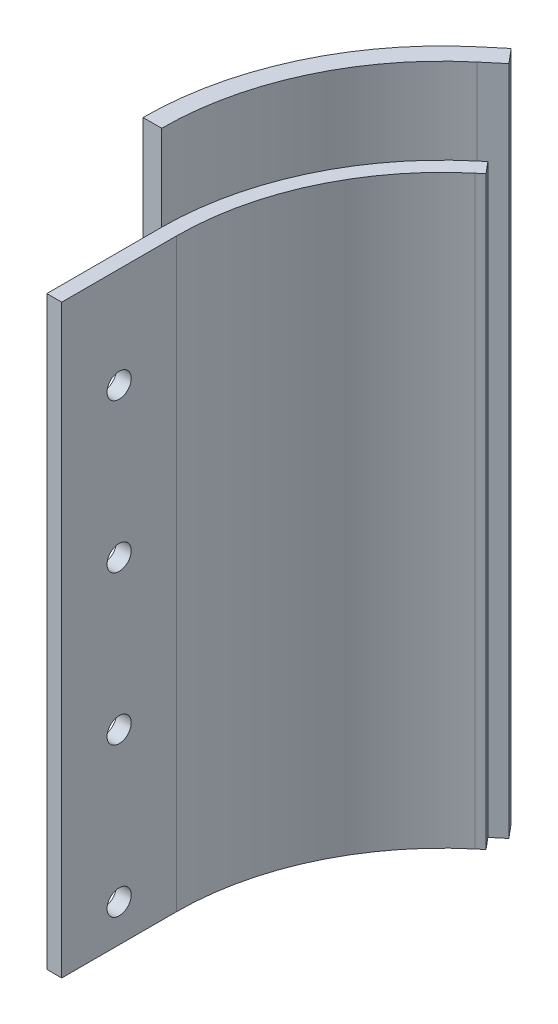
ISO-10303-21;
HEADER;
FILE_DESCRIPTION(('STEP AP214'),'2;1');
FILE_NAME('part.step','',(''),(''),'','','');
FILE_SCHEMA(('AUTOMOTIVE_DESIGN { 1 0 10303 214 1 1 1 1 }'));
ENDSEC;
DATA;
#1=APPLICATION_CONTEXT('core data for automotive mechanical design processes');
#2=APPLICATION_PROTOCOL_DEFINITION('international standard','automotive_design',2000,#1);
#3=PRODUCT_CONTEXT('',#1,'mechanical');
#4=PRODUCT('Part','Part','',(#3));
#5=PRODUCT_RELATED_PRODUCT_CATEGORY('part','',(#4));
#6=PRODUCT_DEFINITION_FORMATION('','',#4);
#7=PRODUCT_DEFINITION_CONTEXT('part definition',#1,'design');
#8=PRODUCT_DEFINITION('design','',#6,#7);
#9=PRODUCT_DEFINITION_SHAPE('','',#8);
#10=(LENGTH_UNIT() NAMED_UNIT(*) SI_UNIT(.MILLI.,.METRE.));
#11=(NAMED_UNIT(*) PLANE_ANGLE_UNIT() SI_UNIT($,.RADIAN.));
#12=(NAMED_UNIT(*) SI_UNIT($,.STERADIAN.) SOLID_ANGLE_UNIT());
#13=UNCERTAINTY_MEASURE_WITH_UNIT(LENGTH_MEASURE(1.E-05),#10,'distance_accuracy_value','');
#14=(GEOMETRIC_REPRESENTATION_CONTEXT(3) GLOBAL_UNCERTAINTY_ASSIGNED_CONTEXT((#13)) GLOBAL_UNIT_ASSIGNED_CONTEXT((#10,
#11,#12)) REPRESENTATION_CONTEXT('',''));
#15=CARTESIAN_POINT('',(0.,0.,0.));
#16=DIRECTION('',(0.,0.,1.));
#17=DIRECTION('',(1.,0.,0.));
#18=AXIS2_PLACEMENT_3D('',#15,#16,#17);
#19=CARTESIAN_POINT('',(18.3464398654779,200.,-65.4116710658726));
#20=DIRECTION('',(-0.766044443118983,0.,0.642787609686533));
#21=DIRECTION('',(0.642787609686533,0.,0.766044443118983));
#22=AXIS2_PLACEMENT_3D('',#19,#20,#21);
#23=PLANE('',#22);
#24=DIRECTION('',(0.,-1.,0.));
#25=VECTOR('',#24,1.);
#26=CARTESIAN_POINT('',(21.5603779139106,200.,-61.5814488502777));
#27=LINE('',#26,#25);
#28=CARTESIAN_POINT('',(21.5603779139106,200.,-61.5814488502777));
#29=VERTEX_POINT('',#28);
#30=CARTESIAN_POINT('',(21.5603779139106,20.,-61.5814488502777));
#31=VERTEX_POINT('',#30);
#32=EDGE_CURVE('E223',#29,#31,#27,.T.);
#33=ORIENTED_EDGE('',*,*,#32,.T.);
#34=DIRECTION('',(-0.642787609686533,0.,-0.766044443118983));
#35=VECTOR('',#34,1.);
#36=CARTESIAN_POINT('',(18.3464398654779,20.,-65.4116710658726));
#37=LINE('',#36,#35);
#38=CARTESIAN_POINT('',(18.3464398654779,20.,-65.4116710658726));
#39=VERTEX_POINT('',#38);
#40=EDGE_CURVE('E142',#31,#39,#37,.T.);
#41=ORIENTED_EDGE('',*,*,#40,.T.);
#42=DIRECTION('',(0.,-1.,0.));
#43=VECTOR('',#42,1.);
#44=CARTESIAN_POINT('',(18.3464398654779,200.,-65.4116710658726));
#45=LINE('',#44,#43);
#46=CARTESIAN_POINT('',(18.3464398654779,200.,-65.4116710658726));
#47=VERTEX_POINT('',#46);
#48=EDGE_CURVE('E40',#47,#39,#45,.T.);
#49=ORIENTED_EDGE('',*,*,#48,.F.);
#50=DIRECTION('',(-0.642787609686533,0.,-0.766044443118983));
#51=VECTOR('',#50,1.);
#52=CARTESIAN_POINT('',(18.3464398654779,200.,-65.4116710658726));
#53=LINE('',#52,#51);
#54=EDGE_CURVE('E209',#29,#47,#53,.T.);
#55=ORIENTED_EDGE('',*,*,#54,.F.);
#56=EDGE_LOOP('',(#33,#41,#49,#55));
#57=FACE_BOUND('',#56,.T.);
#58=ADVANCED_FACE('F33',(#57),#23,.F.);
#59=CARTESIAN_POINT('',(18.3464398654779,200.,-65.4116710658726));
#60=DIRECTION('',(0.642787609686534,0.,0.766044443118983));
#61=DIRECTION('',(0.766044443118983,0.,-0.642787609686534));
#62=AXIS2_PLACEMENT_3D('',#59,#60,#61);
#63=PLANE('',#62);
#64=DIRECTION('',(-0.766044443118983,0.,0.642787609686534));
#65=VECTOR('',#64,1.);
#66=CARTESIAN_POINT('',(18.3464398654779,20.,-65.4116710658726));
#67=LINE('',#66,#65);
#68=CARTESIAN_POINT('',(13.6735687624521,20.,-61.4906666467847));
#69=VERTEX_POINT('',#68);
#70=EDGE_CURVE('E225',#39,#69,#67,.T.);
#71=ORIENTED_EDGE('',*,*,#70,.T.);
#72=DIRECTION('',(0.,-1.,0.));
#73=VECTOR('',#72,1.);
#74=CARTESIAN_POINT('',(13.6735687624521,200.,-61.4906666467847));
#75=LINE('',#74,#73);
#76=CARTESIAN_POINT('',(13.6735687624521,200.,-61.4906666467847));
#77=VERTEX_POINT('',#76);
#78=EDGE_CURVE('E238',#77,#69,#75,.T.);
#79=ORIENTED_EDGE('',*,*,#78,.F.);
#80=DIRECTION('',(-0.766044443118983,0.,0.642787609686534));
#81=VECTOR('',#80,1.);
#82=CARTESIAN_POINT('',(18.3464398654779,200.,-65.4116710658726));
#83=LINE('',#82,#81);
#84=EDGE_CURVE('E212',#47,#77,#83,.T.);
#85=ORIENTED_EDGE('',*,*,#84,.F.);
#86=ORIENTED_EDGE('',*,*,#48,.T.);
#87=EDGE_LOOP('',(#71,#79,#85,#86));
#88=FACE_BOUND('',#87,.T.);
#89=ADVANCED_FACE('F243',(#88),#63,.F.);
#90=CARTESIAN_POINT('',(65.2703644666136,200.,0.));
#91=DIRECTION('',(0.,-1.,0.));
#92=DIRECTION('',(0.,0.,-1.));
#93=AXIS2_PLACEMENT_3D('',#90,#91,#92);
#94=CYLINDRICAL_SURFACE('',#93,80.2703644666136);
#95=CARTESIAN_POINT('',(65.2703644666136,20.,0.));
#96=DIRECTION('',(0.,1.,0.));
#97=DIRECTION('',(0.,0.,1.));
#98=AXIS2_PLACEMENT_3D('',#95,#96,#97);
#99=CIRCLE('',#98,80.2703644666136);
#100=CARTESIAN_POINT('',(-15.,20.,0.));
#101=VERTEX_POINT('',#100);
#102=EDGE_CURVE('E227',#69,#101,#99,.T.);
#103=ORIENTED_EDGE('',*,*,#102,.T.);
#104=DIRECTION('',(0.,-1.,0.));
#105=VECTOR('',#104,1.);
#106=CARTESIAN_POINT('',(-15.,200.,0.));
#107=LINE('',#106,#105);
#108=CARTESIAN_POINT('',(-15.,200.,0.));
#109=VERTEX_POINT('',#108);
#110=EDGE_CURVE('E235',#109,#101,#107,.T.);
#111=ORIENTED_EDGE('',*,*,#110,.F.);
#112=CARTESIAN_POINT('',(65.2703644666136,200.,0.));
#113=DIRECTION('',(0.,1.,0.));
#114=DIRECTION('',(0.,0.,1.));
#115=AXIS2_PLACEMENT_3D('',#112,#113,#114);
#116=CIRCLE('',#115,80.2703644666136);
#117=EDGE_CURVE('E215',#77,#109,#116,.T.);
#118=ORIENTED_EDGE('',*,*,#117,.F.);
#119=ORIENTED_EDGE('',*,*,#78,.T.);
#120=EDGE_LOOP('',(#103,#111,#118,#119));
#121=FACE_BOUND('',#120,.T.);
#122=ADVANCED_FACE('F251',(#121),#94,.T.);
#123=CARTESIAN_POINT('',(-15.,200.,0.));
#124=DIRECTION('',(0.,0.,-1.));
#125=DIRECTION('',(-1.,0.,0.));
#126=AXIS2_PLACEMENT_3D('',#123,#124,#125);
#127=PLANE('',#126);
#128=DIRECTION('',(1.,0.,0.));
#129=VECTOR('',#128,1.);
#130=CARTESIAN_POINT('',(-15.,20.,0.));
#131=LINE('',#130,#129);
#132=CARTESIAN_POINT('',(-9.99999999999999,20.,0.));
#133=VERTEX_POINT('',#132);
#134=EDGE_CURVE('E213',#101,#133,#131,.T.);
#135=ORIENTED_EDGE('',*,*,#134,.T.);
#136=DIRECTION('',(0.,1.,0.));
#137=VECTOR('',#136,1.);
#138=CARTESIAN_POINT('',(-9.99999999999999,-78.4842230054058,0.));
#139=LINE('',#138,#137);
#140=CARTESIAN_POINT('',(-9.99999999999999,177.,0.));
#141=VERTEX_POINT('',#140);
#142=EDGE_CURVE('E54',#133,#141,#139,.T.);
#143=ORIENTED_EDGE('',*,*,#142,.T.);
#144=DIRECTION('',(0.,-1.,0.));
#145=VECTOR('',#144,1.);
#146=CARTESIAN_POINT('',(-9.99999999999999,200.,0.));
#147=LINE('',#146,#145);
#148=CARTESIAN_POINT('',(-9.99999999999999,200.,0.));
#149=VERTEX_POINT('',#148);
#150=EDGE_CURVE('E233',#149,#141,#147,.T.);
#151=ORIENTED_EDGE('',*,*,#150,.F.);
#152=DIRECTION('',(1.,0.,0.));
#153=VECTOR('',#152,1.);
#154=CARTESIAN_POINT('',(-15.,200.,0.));
#155=LINE('',#154,#153);
#156=EDGE_CURVE('E217',#109,#149,#155,.T.);
#157=ORIENTED_EDGE('',*,*,#156,.F.);
#158=ORIENTED_EDGE('',*,*,#110,.T.);
#159=EDGE_LOOP('',(#135,#143,#151,#157,#158));
#160=FACE_BOUND('',#159,.T.);
#161=ADVANCED_FACE('F254',(#160),#127,.F.);
#162=CARTESIAN_POINT('',(65.2703644666136,200.,0.));
#163=DIRECTION('',(0.,-1.,0.));
#164=DIRECTION('',(0.,0.,-1.));
#165=AXIS2_PLACEMENT_3D('',#162,#163,#164);
#166=CYLINDRICAL_SURFACE('',#165,75.2703644666136);
#167=ORIENTED_EDGE('',*,*,#150,.T.);
#168=CARTESIAN_POINT('',(65.2703644666136,177.,0.));
#169=DIRECTION('',(0.,1.,0.));
#170=DIRECTION('',(0.,0.,1.));
#171=AXIS2_PLACEMENT_3D('',#168,#169,#170);
#172=CIRCLE('',#171,75.2703644666136);
#173=CARTESIAN_POINT('',(16.8875068108848,177.,-57.6604444311898));
#174=VERTEX_POINT('',#173);
#175=EDGE_CURVE('E170',#174,#141,#172,.T.);
#176=ORIENTED_EDGE('',*,*,#175,.F.);
#177=DIRECTION('',(0.,-1.,0.));
#178=VECTOR('',#177,1.);
#179=CARTESIAN_POINT('',(16.8875068108848,200.,-57.6604444311898));
#180=LINE('',#179,#178);
#181=CARTESIAN_POINT('',(16.8875068108848,200.,-57.6604444311898));
#182=VERTEX_POINT('',#181);
#183=EDGE_CURVE('E231',#182,#174,#180,.T.);
#184=ORIENTED_EDGE('',*,*,#183,.F.);
#185=CARTESIAN_POINT('',(65.2703644666136,200.,0.));
#186=DIRECTION('',(0.,-1.,0.));
#187=DIRECTION('',(0.,0.,1.));
#188=AXIS2_PLACEMENT_3D('',#185,#186,#187);
#189=CIRCLE('',#188,75.2703644666136);
#190=EDGE_CURVE('E219',#149,#182,#189,.T.);
#191=ORIENTED_EDGE('',*,*,#190,.F.);
#192=EDGE_LOOP('',(#167,#176,#184,#191));
#193=FACE_BOUND('',#192,.T.);
#194=ADVANCED_FACE('F262',(#193),#166,.F.);
#195=CARTESIAN_POINT('',(21.5603779139106,200.,-61.5814488502777));
#196=DIRECTION('',(-0.642787609686533,0.,-0.766044443118983));
#197=DIRECTION('',(-0.766044443118983,0.,0.642787609686533));
#198=AXIS2_PLACEMENT_3D('',#195,#196,#197);
#199=PLANE('',#198);
#200=DIRECTION('',(-0.766044443118983,0.,0.642787609686533));
#201=VECTOR('',#200,1.);
#202=CARTESIAN_POINT('',(16.8875068108848,177.,-57.6604444311898));
#203=LINE('',#202,#201);
#204=CARTESIAN_POINT('',(18.4962001414346,177.,-59.0102984115315));
#205=VERTEX_POINT('',#204);
#206=EDGE_CURVE('E130',#205,#174,#203,.T.);
#207=ORIENTED_EDGE('',*,*,#206,.F.);
#208=DIRECTION('',(0.,1.,0.));
#209=VECTOR('',#208,1.);
#210=CARTESIAN_POINT('',(18.4962001414346,20.,-59.0102984115315));
#211=LINE('',#210,#209);
#212=CARTESIAN_POINT('',(18.4962001414346,20.,-59.0102984115315));
#213=VERTEX_POINT('',#212);
#214=EDGE_CURVE('E46',#213,#205,#211,.T.);
#215=ORIENTED_EDGE('',*,*,#214,.F.);
#216=DIRECTION('',(-0.766044443118982,0.,0.642787609686534));
#217=VECTOR('',#216,1.);
#218=CARTESIAN_POINT('',(21.5603779139106,20.,-61.5814488502777));
#219=LINE('',#218,#217);
#220=EDGE_CURVE('E127',#31,#213,#219,.T.);
#221=ORIENTED_EDGE('',*,*,#220,.F.);
#222=ORIENTED_EDGE('',*,*,#32,.F.);
#223=DIRECTION('',(0.766044443118983,0.,-0.642787609686533));
#224=VECTOR('',#223,1.);
#225=CARTESIAN_POINT('',(21.5603779139106,200.,-61.5814488502777));
#226=LINE('',#225,#224);
#227=EDGE_CURVE('E221',#182,#29,#226,.T.);
#228=ORIENTED_EDGE('',*,*,#227,.F.);
#229=ORIENTED_EDGE('',*,*,#183,.T.);
#230=EDGE_LOOP('',(#207,#215,#221,#222,#228,#229));
#231=FACE_BOUND('',#230,.T.);
#232=ADVANCED_FACE('F124',(#231),#199,.F.);
#233=CARTESIAN_POINT('',(65.2703644666136,200.,0.));
#234=DIRECTION('',(0.,1.,0.));
#235=DIRECTION('',(0.,0.,1.));
#236=AXIS2_PLACEMENT_3D('',#233,#234,#235);
#237=PLANE('',#236);
#238=ORIENTED_EDGE('',*,*,#54,.T.);
#239=ORIENTED_EDGE('',*,*,#84,.T.);
#240=ORIENTED_EDGE('',*,*,#117,.T.);
#241=ORIENTED_EDGE('',*,*,#156,.T.);
#242=ORIENTED_EDGE('',*,*,#190,.T.);
#243=ORIENTED_EDGE('',*,*,#227,.T.);
#244=EDGE_LOOP('',(#238,#239,#240,#241,#242,#243));
#245=FACE_BOUND('',#244,.T.);
#246=ADVANCED_FACE('F257',(#245),#237,.T.);
#247=CARTESIAN_POINT('',(65.2703644666136,20.,0.));
#248=DIRECTION('',(0.,1.,0.));
#249=DIRECTION('',(0.,0.,1.));
#250=AXIS2_PLACEMENT_3D('',#247,#248,#249);
#251=PLANE('',#250);
#252=ORIENTED_EDGE('',*,*,#40,.F.);
#253=ORIENTED_EDGE('',*,*,#220,.T.);
#254=DIRECTION('',(0.642787609686534,0.,0.766044443118983));
#255=VECTOR('',#254,1.);
#256=CARTESIAN_POINT('',(18.4962001414346,20.,-59.0102984115315));
#257=LINE('',#256,#255);
#258=CARTESIAN_POINT('',(21.0673505801808,20.,-55.9461206390556));
#259=VERTEX_POINT('',#258);
#260=EDGE_CURVE('E132',#213,#259,#257,.T.);
#261=ORIENTED_EDGE('',*,*,#260,.T.);
#262=DIRECTION('',(-0.766044443118983,0.,0.642787609686533));
#263=VECTOR('',#262,1.);
#264=CARTESIAN_POINT('',(19.4586572496309,20.,-54.5962666587139));
#265=LINE('',#264,#263);
#266=CARTESIAN_POINT('',(19.4586572496309,20.,-54.5962666587139));
#267=VERTEX_POINT('',#266);
#268=EDGE_CURVE('E178',#259,#267,#265,.T.);
#269=ORIENTED_EDGE('',*,*,#268,.T.);
#270=CARTESIAN_POINT('',(65.2703644666136,20.,0.));
#271=DIRECTION('',(0.,1.,0.));
#272=DIRECTION('',(0.,0.,1.));
#273=AXIS2_PLACEMENT_3D('',#270,#271,#272);
#274=CIRCLE('',#273,71.2703644666136);
#275=CARTESIAN_POINT('',(-5.99999999999999,20.,0.));
#276=VERTEX_POINT('',#275);
#277=EDGE_CURVE('E176',#267,#276,#274,.T.);
#278=ORIENTED_EDGE('',*,*,#277,.T.);
#279=DIRECTION('',(0.,0.,1.));
#280=VECTOR('',#279,1.);
#281=CARTESIAN_POINT('',(-5.99999999999999,20.,30.7991819837358));
#282=LINE('',#281,#280);
#283=CARTESIAN_POINT('',(-5.99999999999999,20.,30.7991819837358));
#284=VERTEX_POINT('',#283);
#285=EDGE_CURVE('E173',#276,#284,#282,.T.);
#286=ORIENTED_EDGE('',*,*,#285,.T.);
#287=DIRECTION('',(-1.,0.,0.));
#288=VECTOR('',#287,1.);
#289=CARTESIAN_POINT('',(-9.99999999999999,20.,30.7991819837358));
#290=LINE('',#289,#288);
#291=CARTESIAN_POINT('',(-9.99999999999999,20.,30.7991819837358));
#292=VERTEX_POINT('',#291);
#293=EDGE_CURVE('E171',#284,#292,#290,.T.);
#294=ORIENTED_EDGE('',*,*,#293,.T.);
#295=DIRECTION('',(0.,0.,-1.));
#296=VECTOR('',#295,1.);
#297=CARTESIAN_POINT('',(-9.99999999999999,20.,0.));
#298=LINE('',#297,#296);
#299=EDGE_CURVE('E180',#292,#133,#298,.T.);
#300=ORIENTED_EDGE('',*,*,#299,.T.);
#301=ORIENTED_EDGE('',*,*,#134,.F.);
#302=ORIENTED_EDGE('',*,*,#102,.F.);
#303=ORIENTED_EDGE('',*,*,#70,.F.);
#304=EDGE_LOOP('',(#252,#253,#261,#269,#278,#286,#294,#300,#301,#302,#303));
#305=FACE_BOUND('',#304,.T.);
#306=ADVANCED_FACE('F140',(#305),#251,.F.);
#307=CARTESIAN_POINT('',(19.4586572496309,-78.4842230054058,-54.5962666587139));
#308=DIRECTION('',(0.642787609686533,0.,0.766044443118983));
#309=DIRECTION('',(0.766044443118983,0.,-0.642787609686533));
#310=AXIS2_PLACEMENT_3D('',#307,#308,#309);
#311=PLANE('',#310);
#312=DIRECTION('',(0.,1.,0.));
#313=VECTOR('',#312,1.);
#314=CARTESIAN_POINT('',(21.0673505801808,20.,-55.9461206390556));
#315=LINE('',#314,#313);
#316=CARTESIAN_POINT('',(21.0673505801808,177.,-55.9461206390556));
#317=VERTEX_POINT('',#316);
#318=EDGE_CURVE('E131',#259,#317,#315,.T.);
#319=ORIENTED_EDGE('',*,*,#318,.T.);
#320=DIRECTION('',(0.766044443118983,0.,-0.642787609686533));
#321=VECTOR('',#320,1.);
#322=CARTESIAN_POINT('',(19.4586572496309,177.,-54.5962666587139));
#323=LINE('',#322,#321);
#324=CARTESIAN_POINT('',(19.4586572496309,177.,-54.5962666587139));
#325=VERTEX_POINT('',#324);
#326=EDGE_CURVE('E195',#325,#317,#323,.T.);
#327=ORIENTED_EDGE('',*,*,#326,.F.);
#328=DIRECTION('',(0.,1.,0.));
#329=VECTOR('',#328,1.);
#330=CARTESIAN_POINT('',(19.4586572496309,-78.4842230054058,-54.5962666587139));
#331=LINE('',#330,#329);
#332=EDGE_CURVE('E174',#267,#325,#331,.T.);
#333=ORIENTED_EDGE('',*,*,#332,.F.);
#334=ORIENTED_EDGE('',*,*,#268,.F.);
#335=EDGE_LOOP('',(#319,#327,#333,#334));
#336=FACE_BOUND('',#335,.T.);
#337=ADVANCED_FACE('F268',(#336),#311,.T.);
#338=CARTESIAN_POINT('',(65.2703644666136,-78.4842230054058,0.));
#339=DIRECTION('',(0.,1.,0.));
#340=DIRECTION('',(0.,0.,1.));
#341=AXIS2_PLACEMENT_3D('',#338,#339,#340);
#342=CYLINDRICAL_SURFACE('',#341,71.2703644666136);
#343=ORIENTED_EDGE('',*,*,#277,.F.);
#344=ORIENTED_EDGE('',*,*,#332,.T.);
#345=CARTESIAN_POINT('',(65.2703644666136,177.,0.));
#346=DIRECTION('',(0.,-1.,0.));
#347=DIRECTION('',(0.,0.,1.));
#348=AXIS2_PLACEMENT_3D('',#345,#346,#347);
#349=CIRCLE('',#348,71.2703644666136);
#350=CARTESIAN_POINT('',(-5.99999999999999,177.,0.));
#351=VERTEX_POINT('',#350);
#352=EDGE_CURVE('E192',#351,#325,#349,.T.);
#353=ORIENTED_EDGE('',*,*,#352,.F.);
#354=DIRECTION('',(0.,1.,0.));
#355=VECTOR('',#354,1.);
#356=CARTESIAN_POINT('',(-5.99999999999999,-78.4842230054058,0.));
#357=LINE('',#356,#355);
#358=EDGE_CURVE('E200',#276,#351,#357,.T.);
#359=ORIENTED_EDGE('',*,*,#358,.F.);
#360=EDGE_LOOP('',(#343,#344,#353,#359));
#361=FACE_BOUND('',#360,.T.);
#362=ADVANCED_FACE('F274',(#361),#342,.F.);
#363=CARTESIAN_POINT('',(-5.99999999999999,-78.4842230054058,30.7991819837358));
#364=DIRECTION('',(1.,0.,0.));
#365=DIRECTION('',(0.,0.,-1.));
#366=AXIS2_PLACEMENT_3D('',#363,#364,#365);
#367=PLANE('',#366);
#368=CARTESIAN_POINT('',(-5.99999999999999,30.,15.3995909918679));
#369=DIRECTION('',(1.,0.,0.));
#370=DIRECTION('',(0.,0.,-1.));
#371=AXIS2_PLACEMENT_3D('',#368,#369,#370);
#372=CIRCLE('',#371,3.25);
#373=CARTESIAN_POINT('',(-5.99999999999999,30.,12.1495909918679));
#374=VERTEX_POINT('',#373);
#375=EDGE_CURVE('E167',#374,#374,#372,.T.);
#376=ORIENTED_EDGE('',*,*,#375,.F.);
#377=EDGE_LOOP('',(#376));
#378=FACE_BOUND('',#377,.T.);
#379=CARTESIAN_POINT('',(-5.99999999999999,70.,15.3995909918679));
#380=DIRECTION('',(1.,0.,0.));
#381=DIRECTION('',(0.,0.,-1.));
#382=AXIS2_PLACEMENT_3D('',#379,#380,#381);
#383=CIRCLE('',#382,3.25);
#384=CARTESIAN_POINT('',(-5.99999999999999,70.,12.1495909918679));
#385=VERTEX_POINT('',#384);
#386=EDGE_CURVE('E164',#385,#385,#383,.T.);
#387=ORIENTED_EDGE('',*,*,#386,.F.);
#388=EDGE_LOOP('',(#387));
#389=FACE_BOUND('',#388,.T.);
#390=CARTESIAN_POINT('',(-5.99999999999999,110.,15.3995909918679));
#391=DIRECTION('',(1.,0.,0.));
#392=DIRECTION('',(0.,0.,-1.));
#393=AXIS2_PLACEMENT_3D('',#390,#391,#392);
#394=CIRCLE('',#393,3.25);
#395=CARTESIAN_POINT('',(-5.99999999999999,110.,12.1495909918679));
#396=VERTEX_POINT('',#395);
#397=EDGE_CURVE('E161',#396,#396,#394,.T.);
#398=ORIENTED_EDGE('',*,*,#397,.F.);
#399=EDGE_LOOP('',(#398));
#400=FACE_BOUND('',#399,.T.);
#401=CARTESIAN_POINT('',(-5.99999999999999,150.,15.3995909918679));
#402=DIRECTION('',(1.,0.,0.));
#403=DIRECTION('',(0.,0.,-1.));
#404=AXIS2_PLACEMENT_3D('',#401,#402,#403);
#405=CIRCLE('',#404,3.25);
#406=CARTESIAN_POINT('',(-5.99999999999999,150.,12.1495909918679));
#407=VERTEX_POINT('',#406);
#408=EDGE_CURVE('E150',#407,#407,#405,.T.);
#409=ORIENTED_EDGE('',*,*,#408,.F.);
#410=EDGE_LOOP('',(#409));
#411=FACE_BOUND('',#410,.T.);
#412=ORIENTED_EDGE('',*,*,#285,.F.);
#413=ORIENTED_EDGE('',*,*,#358,.T.);
#414=DIRECTION('',(0.,0.,-1.));
#415=VECTOR('',#414,1.);
#416=CARTESIAN_POINT('',(-5.99999999999999,177.,30.7991819837358));
#417=LINE('',#416,#415);
#418=CARTESIAN_POINT('',(-5.99999999999999,177.,30.7991819837358));
#419=VERTEX_POINT('',#418);
#420=EDGE_CURVE('E189',#419,#351,#417,.T.);
#421=ORIENTED_EDGE('',*,*,#420,.F.);
#422=DIRECTION('',(0.,1.,0.));
#423=VECTOR('',#422,1.);
#424=CARTESIAN_POINT('',(-5.99999999999999,-78.4842230054058,30.7991819837358));
#425=LINE('',#424,#423);
#426=EDGE_CURVE('E202',#284,#419,#425,.T.);
#427=ORIENTED_EDGE('',*,*,#426,.F.);
#428=EDGE_LOOP('',(#412,#413,#421,#427));
#429=FACE_BOUND('',#428,.T.);
#430=ADVANCED_FACE('F278',(#378,#389,#400,#411,#429),#367,.T.);
#431=CARTESIAN_POINT('',(-9.99999999999999,-78.4842230054058,30.7991819837358));
#432=DIRECTION('',(0.,0.,1.));
#433=DIRECTION('',(1.,0.,0.));
#434=AXIS2_PLACEMENT_3D('',#431,#432,#433);
#435=PLANE('',#434);
#436=ORIENTED_EDGE('',*,*,#293,.F.);
#437=ORIENTED_EDGE('',*,*,#426,.T.);
#438=DIRECTION('',(1.,0.,0.));
#439=VECTOR('',#438,1.);
#440=CARTESIAN_POINT('',(-9.99999999999999,177.,30.7991819837358));
#441=LINE('',#440,#439);
#442=CARTESIAN_POINT('',(-9.99999999999999,177.,30.7991819837358));
#443=VERTEX_POINT('',#442);
#444=EDGE_CURVE('E186',#443,#419,#441,.T.);
#445=ORIENTED_EDGE('',*,*,#444,.F.);
#446=DIRECTION('',(0.,1.,0.));
#447=VECTOR('',#446,1.);
#448=CARTESIAN_POINT('',(-9.99999999999999,-78.4842230054058,30.7991819837358));
#449=LINE('',#448,#447);
#450=EDGE_CURVE('E204',#292,#443,#449,.T.);
#451=ORIENTED_EDGE('',*,*,#450,.F.);
#452=EDGE_LOOP('',(#436,#437,#445,#451));
#453=FACE_BOUND('',#452,.T.);
#454=ADVANCED_FACE('F283',(#453),#435,.T.);
#455=CARTESIAN_POINT('',(-9.99999999999999,-78.4842230054058,0.));
#456=DIRECTION('',(-1.,0.,0.));
#457=DIRECTION('',(0.,0.,1.));
#458=AXIS2_PLACEMENT_3D('',#455,#456,#457);
#459=PLANE('',#458);
#460=CARTESIAN_POINT('',(-9.99999999999999,30.,15.3995909918679));
#461=DIRECTION('',(-1.,0.,0.));
#462=DIRECTION('',(0.,0.,1.));
#463=AXIS2_PLACEMENT_3D('',#460,#461,#462);
#464=CIRCLE('',#463,3.25);
#465=CARTESIAN_POINT('',(-9.99999999999999,30.,18.6495909918679));
#466=VERTEX_POINT('',#465);
#467=EDGE_CURVE('E147',#466,#466,#464,.T.);
#468=ORIENTED_EDGE('',*,*,#467,.F.);
#469=EDGE_LOOP('',(#468));
#470=FACE_BOUND('',#469,.T.);
#471=CARTESIAN_POINT('',(-9.99999999999999,70.,15.3995909918679));
#472=DIRECTION('',(-1.,0.,0.));
#473=DIRECTION('',(0.,0.,1.));
#474=AXIS2_PLACEMENT_3D('',#471,#472,#473);
#475=CIRCLE('',#474,3.25);
#476=CARTESIAN_POINT('',(-9.99999999999999,70.,18.6495909918679));
#477=VERTEX_POINT('',#476);
#478=EDGE_CURVE('E151',#477,#477,#475,.T.);
#479=ORIENTED_EDGE('',*,*,#478,.F.);
#480=EDGE_LOOP('',(#479));
#481=FACE_BOUND('',#480,.T.);
#482=CARTESIAN_POINT('',(-9.99999999999999,110.,15.3995909918679));
#483=DIRECTION('',(-1.,0.,0.));
#484=DIRECTION('',(0.,0.,1.));
#485=AXIS2_PLACEMENT_3D('',#482,#483,#484);
#486=CIRCLE('',#485,3.25);
#487=CARTESIAN_POINT('',(-9.99999999999999,110.,18.6495909918679));
#488=VERTEX_POINT('',#487);
#489=EDGE_CURVE('E154',#488,#488,#486,.T.);
#490=ORIENTED_EDGE('',*,*,#489,.F.);
#491=EDGE_LOOP('',(#490));
#492=FACE_BOUND('',#491,.T.);
#493=CARTESIAN_POINT('',(-9.99999999999999,150.,15.3995909918679));
#494=DIRECTION('',(-1.,0.,0.));
#495=DIRECTION('',(0.,0.,1.));
#496=AXIS2_PLACEMENT_3D('',#493,#494,#495);
#497=CIRCLE('',#496,3.25);
#498=CARTESIAN_POINT('',(-9.99999999999999,150.,18.6495909918679));
#499=VERTEX_POINT('',#498);
#500=EDGE_CURVE('E145',#499,#499,#497,.T.);
#501=ORIENTED_EDGE('',*,*,#500,.F.);
#502=EDGE_LOOP('',(#501));
#503=FACE_BOUND('',#502,.T.);
#504=ORIENTED_EDGE('',*,*,#299,.F.);
#505=ORIENTED_EDGE('',*,*,#450,.T.);
#506=DIRECTION('',(0.,0.,1.));
#507=VECTOR('',#506,1.);
#508=CARTESIAN_POINT('',(-9.99999999999999,177.,0.));
#509=LINE('',#508,#507);
#510=EDGE_CURVE('E183',#141,#443,#509,.T.);
#511=ORIENTED_EDGE('',*,*,#510,.F.);
#512=ORIENTED_EDGE('',*,*,#142,.F.);
#513=EDGE_LOOP('',(#504,#505,#511,#512));
#514=FACE_BOUND('',#513,.T.);
#515=ADVANCED_FACE('F287',(#470,#481,#492,#503,#514),#459,.T.);
#516=CARTESIAN_POINT('',(65.2703644666136,177.,0.));
#517=DIRECTION('',(0.,1.,0.));
#518=DIRECTION('',(0.,0.,1.));
#519=AXIS2_PLACEMENT_3D('',#516,#517,#518);
#520=PLANE('',#519);
#521=DIRECTION('',(0.642787609686534,0.,0.766044443118983));
#522=VECTOR('',#521,1.);
#523=CARTESIAN_POINT('',(66.8790577971634,177.,-1.34985398034164));
#524=LINE('',#523,#522);
#525=EDGE_CURVE('E11',#205,#317,#524,.T.);
#526=ORIENTED_EDGE('',*,*,#525,.F.);
#527=ORIENTED_EDGE('',*,*,#206,.T.);
#528=ORIENTED_EDGE('',*,*,#175,.T.);
#529=ORIENTED_EDGE('',*,*,#510,.T.);
#530=ORIENTED_EDGE('',*,*,#444,.T.);
#531=ORIENTED_EDGE('',*,*,#420,.T.);
#532=ORIENTED_EDGE('',*,*,#352,.T.);
#533=ORIENTED_EDGE('',*,*,#326,.T.);
#534=EDGE_LOOP('',(#526,#527,#528,#529,#530,#531,#532,#533));
#535=FACE_BOUND('',#534,.T.);
#536=ADVANCED_FACE('F265',(#535),#520,.T.);
#537=CARTESIAN_POINT('',(24.1315283526567,150.,15.3995909918679));
#538=DIRECTION('',(-1.,0.,0.));
#539=DIRECTION('',(0.,0.,1.));
#540=AXIS2_PLACEMENT_3D('',#537,#538,#539);
#541=CYLINDRICAL_SURFACE('',#540,3.25);
#542=ORIENTED_EDGE('',*,*,#408,.T.);
#543=EDGE_LOOP('',(#542));
#544=FACE_BOUND('',#543,.T.);
#545=ORIENTED_EDGE('',*,*,#500,.T.);
#546=EDGE_LOOP('',(#545));
#547=FACE_BOUND('',#546,.T.);
#548=ADVANCED_FACE('F295',(#544,#547),#541,.F.);
#549=CARTESIAN_POINT('',(24.1315283526567,110.,15.3995909918679));
#550=DIRECTION('',(-1.,0.,0.));
#551=DIRECTION('',(0.,0.,1.));
#552=AXIS2_PLACEMENT_3D('',#549,#550,#551);
#553=CYLINDRICAL_SURFACE('',#552,3.25);
#554=ORIENTED_EDGE('',*,*,#397,.T.);
#555=EDGE_LOOP('',(#554));
#556=FACE_BOUND('',#555,.T.);
#557=ORIENTED_EDGE('',*,*,#489,.T.);
#558=EDGE_LOOP('',(#557));
#559=FACE_BOUND('',#558,.T.);
#560=ADVANCED_FACE('F374',(#556,#559),#553,.F.);
#561=CARTESIAN_POINT('',(24.1315283526567,70.,15.3995909918679));
#562=DIRECTION('',(-1.,0.,0.));
#563=DIRECTION('',(0.,0.,1.));
#564=AXIS2_PLACEMENT_3D('',#561,#562,#563);
#565=CYLINDRICAL_SURFACE('',#564,3.25);
#566=ORIENTED_EDGE('',*,*,#386,.T.);
#567=EDGE_LOOP('',(#566));
#568=FACE_BOUND('',#567,.T.);
#569=ORIENTED_EDGE('',*,*,#478,.T.);
#570=EDGE_LOOP('',(#569));
#571=FACE_BOUND('',#570,.T.);
#572=ADVANCED_FACE('F366',(#568,#571),#565,.F.);
#573=CARTESIAN_POINT('',(24.1315283526567,30.,15.3995909918679));
#574=DIRECTION('',(-1.,0.,0.));
#575=DIRECTION('',(0.,0.,1.));
#576=AXIS2_PLACEMENT_3D('',#573,#574,#575);
#577=CYLINDRICAL_SURFACE('',#576,3.25);
#578=ORIENTED_EDGE('',*,*,#375,.T.);
#579=EDGE_LOOP('',(#578));
#580=FACE_BOUND('',#579,.T.);
#581=ORIENTED_EDGE('',*,*,#467,.T.);
#582=EDGE_LOOP('',(#581));
#583=FACE_BOUND('',#582,.T.);
#584=ADVANCED_FACE('F357',(#580,#583),#577,.F.);
#585=CARTESIAN_POINT('',(18.4962001414346,20.,-59.0102984115315));
#586=DIRECTION('',(-0.766044443118983,0.,0.642787609686534));
#587=DIRECTION('',(0.642787609686534,0.,0.766044443118983));
#588=AXIS2_PLACEMENT_3D('',#585,#586,#587);
#589=PLANE('',#588);
#590=ORIENTED_EDGE('',*,*,#525,.T.);
#591=ORIENTED_EDGE('',*,*,#318,.F.);
#592=ORIENTED_EDGE('',*,*,#260,.F.);
#593=ORIENTED_EDGE('',*,*,#214,.T.);
#594=EDGE_LOOP('',(#590,#591,#592,#593));
#595=FACE_BOUND('',#594,.T.);
#596=ADVANCED_FACE('F135',(#595),#589,.F.);
#597=CLOSED_SHELL('',(#58,#89,#122,#161,#194,#232,#246,#306,#337,#362,#430,#454,#515,#536,#548,
#560,#572,#584,#596));
#598=MANIFOLD_SOLID_BREP('B2',#597);
#599=ADVANCED_BREP_SHAPE_REPRESENTATION('',(#18,#598),#14);
#600=SHAPE_DEFINITION_REPRESENTATION(#9,#599);
ENDSEC;
END-ISO-10303-21;
